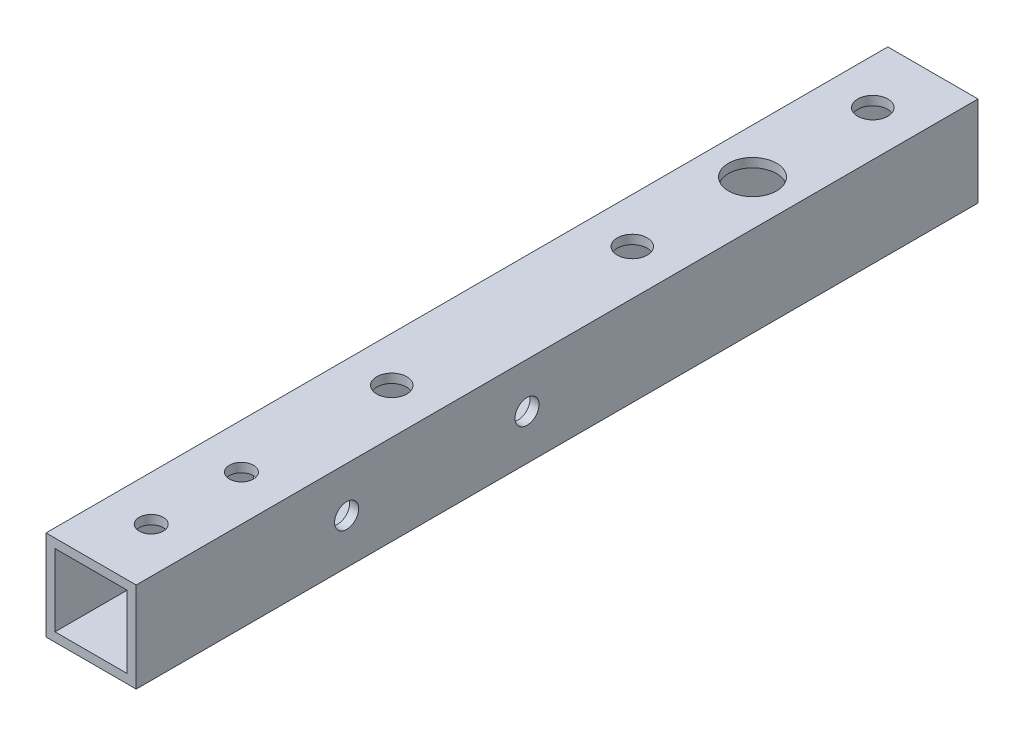
ISO-10303-21;
HEADER;
FILE_DESCRIPTION(('STEP AP214'),'2;1');
FILE_NAME('part.step','',(''),(''),'','','');
FILE_SCHEMA(('AUTOMOTIVE_DESIGN { 1 0 10303 214 1 1 1 1 }'));
ENDSEC;
DATA;
#1=APPLICATION_CONTEXT('core data for automotive mechanical design processes');
#2=APPLICATION_PROTOCOL_DEFINITION('international standard','automotive_design',2000,#1);
#3=PRODUCT_CONTEXT('',#1,'mechanical');
#4=PRODUCT('Part','Part','',(#3));
#5=PRODUCT_RELATED_PRODUCT_CATEGORY('part','',(#4));
#6=PRODUCT_DEFINITION_FORMATION('','',#4);
#7=PRODUCT_DEFINITION_CONTEXT('part definition',#1,'design');
#8=PRODUCT_DEFINITION('design','',#6,#7);
#9=PRODUCT_DEFINITION_SHAPE('','',#8);
#10=(LENGTH_UNIT() NAMED_UNIT(*) SI_UNIT(.MILLI.,.METRE.));
#11=(NAMED_UNIT(*) PLANE_ANGLE_UNIT() SI_UNIT($,.RADIAN.));
#12=(NAMED_UNIT(*) SI_UNIT($,.STERADIAN.) SOLID_ANGLE_UNIT());
#13=UNCERTAINTY_MEASURE_WITH_UNIT(LENGTH_MEASURE(1.E-05),#10,'distance_accuracy_value','');
#14=(GEOMETRIC_REPRESENTATION_CONTEXT(3) GLOBAL_UNCERTAINTY_ASSIGNED_CONTEXT((#13)) GLOBAL_UNIT_ASSIGNED_CONTEXT((#10,
#11,#12)) REPRESENTATION_CONTEXT('',''));
#15=CARTESIAN_POINT('',(0.,0.,0.));
#16=DIRECTION('',(0.,0.,1.));
#17=DIRECTION('',(1.,0.,0.));
#18=AXIS2_PLACEMENT_3D('',#15,#16,#17);
#19=CARTESIAN_POINT('',(0.,0.,140.));
#20=DIRECTION('',(0.,0.,-1.));
#21=DIRECTION('',(-1.,0.,0.));
#22=AXIS2_PLACEMENT_3D('',#19,#20,#21);
#23=PLANE('',#22);
#24=DIRECTION('',(0.,1.,0.));
#25=VECTOR('',#24,1.);
#26=CARTESIAN_POINT('',(7.5,-7.5,140.));
#27=LINE('',#26,#25);
#28=CARTESIAN_POINT('',(7.5,-7.5,140.));
#29=VERTEX_POINT('',#28);
#30=CARTESIAN_POINT('',(7.5,7.5,140.));
#31=VERTEX_POINT('',#30);
#32=EDGE_CURVE('E138',#29,#31,#27,.T.);
#33=ORIENTED_EDGE('',*,*,#32,.T.);
#34=DIRECTION('',(-1.,0.,0.));
#35=VECTOR('',#34,1.);
#36=CARTESIAN_POINT('',(-7.5,7.5,140.));
#37=LINE('',#36,#35);
#38=CARTESIAN_POINT('',(-7.5,7.5,140.));
#39=VERTEX_POINT('',#38);
#40=EDGE_CURVE('E141',#31,#39,#37,.T.);
#41=ORIENTED_EDGE('',*,*,#40,.T.);
#42=DIRECTION('',(0.,-1.,0.));
#43=VECTOR('',#42,1.);
#44=CARTESIAN_POINT('',(-7.5,-7.5,140.));
#45=LINE('',#44,#43);
#46=CARTESIAN_POINT('',(-7.5,-7.5,140.));
#47=VERTEX_POINT('',#46);
#48=EDGE_CURVE('E144',#39,#47,#45,.T.);
#49=ORIENTED_EDGE('',*,*,#48,.T.);
#50=DIRECTION('',(1.,0.,0.));
#51=VECTOR('',#50,1.);
#52=CARTESIAN_POINT('',(-7.5,-7.5,140.));
#53=LINE('',#52,#51);
#54=EDGE_CURVE('E146',#47,#29,#53,.T.);
#55=ORIENTED_EDGE('',*,*,#54,.T.);
#56=EDGE_LOOP('',(#33,#41,#49,#55));
#57=FACE_BOUND('',#56,.T.);
#58=DIRECTION('',(0.,1.,0.));
#59=VECTOR('',#58,1.);
#60=CARTESIAN_POINT('',(6.,6.,140.));
#61=LINE('',#60,#59);
#62=CARTESIAN_POINT('',(6.,-6.,140.));
#63=VERTEX_POINT('',#62);
#64=CARTESIAN_POINT('',(6.,6.,140.));
#65=VERTEX_POINT('',#64);
#66=EDGE_CURVE('E100',#63,#65,#61,.T.);
#67=ORIENTED_EDGE('',*,*,#66,.F.);
#68=DIRECTION('',(1.,0.,0.));
#69=VECTOR('',#68,1.);
#70=CARTESIAN_POINT('',(-6.,-6.,140.));
#71=LINE('',#70,#69);
#72=CARTESIAN_POINT('',(-6.,-6.,140.));
#73=VERTEX_POINT('',#72);
#74=EDGE_CURVE('E122',#73,#63,#71,.T.);
#75=ORIENTED_EDGE('',*,*,#74,.F.);
#76=DIRECTION('',(0.,-1.,0.));
#77=VECTOR('',#76,1.);
#78=CARTESIAN_POINT('',(-6.,6.,140.));
#79=LINE('',#78,#77);
#80=CARTESIAN_POINT('',(-6.,6.,140.));
#81=VERTEX_POINT('',#80);
#82=EDGE_CURVE('E120',#81,#73,#79,.T.);
#83=ORIENTED_EDGE('',*,*,#82,.F.);
#84=DIRECTION('',(-1.,0.,0.));
#85=VECTOR('',#84,1.);
#86=CARTESIAN_POINT('',(-6.,6.,140.));
#87=LINE('',#86,#85);
#88=EDGE_CURVE('E108',#65,#81,#87,.T.);
#89=ORIENTED_EDGE('',*,*,#88,.F.);
#90=EDGE_LOOP('',(#67,#75,#83,#89));
#91=FACE_BOUND('',#90,.T.);
#92=ADVANCED_FACE('F33',(#57,#91),#23,.F.);
#93=CARTESIAN_POINT('',(0.,0.,0.));
#94=DIRECTION('',(0.,0.,-1.));
#95=DIRECTION('',(-1.,0.,0.));
#96=AXIS2_PLACEMENT_3D('',#93,#94,#95);
#97=PLANE('',#96);
#98=DIRECTION('',(0.,1.,0.));
#99=VECTOR('',#98,1.);
#100=CARTESIAN_POINT('',(7.5,-7.5,0.));
#101=LINE('',#100,#99);
#102=CARTESIAN_POINT('',(7.5,-7.5,0.));
#103=VERTEX_POINT('',#102);
#104=CARTESIAN_POINT('',(7.5,7.5,0.));
#105=VERTEX_POINT('',#104);
#106=EDGE_CURVE('E116',#103,#105,#101,.T.);
#107=ORIENTED_EDGE('',*,*,#106,.F.);
#108=DIRECTION('',(1.,0.,0.));
#109=VECTOR('',#108,1.);
#110=CARTESIAN_POINT('',(-7.5,-7.5,0.));
#111=LINE('',#110,#109);
#112=CARTESIAN_POINT('',(-7.5,-7.5,0.));
#113=VERTEX_POINT('',#112);
#114=EDGE_CURVE('E142',#113,#103,#111,.T.);
#115=ORIENTED_EDGE('',*,*,#114,.F.);
#116=DIRECTION('',(0.,-1.,0.));
#117=VECTOR('',#116,1.);
#118=CARTESIAN_POINT('',(-7.5,-7.5,0.));
#119=LINE('',#118,#117);
#120=CARTESIAN_POINT('',(-7.5,7.5,0.));
#121=VERTEX_POINT('',#120);
#122=EDGE_CURVE('E153',#121,#113,#119,.T.);
#123=ORIENTED_EDGE('',*,*,#122,.F.);
#124=DIRECTION('',(-1.,0.,0.));
#125=VECTOR('',#124,1.);
#126=CARTESIAN_POINT('',(-7.5,7.5,0.));
#127=LINE('',#126,#125);
#128=EDGE_CURVE('E151',#105,#121,#127,.T.);
#129=ORIENTED_EDGE('',*,*,#128,.F.);
#130=EDGE_LOOP('',(#107,#115,#123,#129));
#131=FACE_BOUND('',#130,.T.);
#132=DIRECTION('',(1.,0.,0.));
#133=VECTOR('',#132,1.);
#134=CARTESIAN_POINT('',(-6.,-6.,0.));
#135=LINE('',#134,#133);
#136=CARTESIAN_POINT('',(-6.,-6.,0.));
#137=VERTEX_POINT('',#136);
#138=CARTESIAN_POINT('',(6.,-6.,0.));
#139=VERTEX_POINT('',#138);
#140=EDGE_CURVE('E109',#137,#139,#135,.T.);
#141=ORIENTED_EDGE('',*,*,#140,.T.);
#142=DIRECTION('',(0.,1.,0.));
#143=VECTOR('',#142,1.);
#144=CARTESIAN_POINT('',(6.,6.,0.));
#145=LINE('',#144,#143);
#146=CARTESIAN_POINT('',(6.,6.,0.));
#147=VERTEX_POINT('',#146);
#148=EDGE_CURVE('E58',#139,#147,#145,.T.);
#149=ORIENTED_EDGE('',*,*,#148,.T.);
#150=DIRECTION('',(-1.,0.,0.));
#151=VECTOR('',#150,1.);
#152=CARTESIAN_POINT('',(-6.,6.,0.));
#153=LINE('',#152,#151);
#154=CARTESIAN_POINT('',(-6.,6.,0.));
#155=VERTEX_POINT('',#154);
#156=EDGE_CURVE('E115',#147,#155,#153,.T.);
#157=ORIENTED_EDGE('',*,*,#156,.T.);
#158=DIRECTION('',(0.,-1.,0.));
#159=VECTOR('',#158,1.);
#160=CARTESIAN_POINT('',(-6.,6.,0.));
#161=LINE('',#160,#159);
#162=EDGE_CURVE('E130',#155,#137,#161,.T.);
#163=ORIENTED_EDGE('',*,*,#162,.T.);
#164=EDGE_LOOP('',(#141,#149,#157,#163));
#165=FACE_BOUND('',#164,.T.);
#166=ADVANCED_FACE('F261',(#131,#165),#97,.T.);
#167=CARTESIAN_POINT('',(7.5,-7.5,140.));
#168=DIRECTION('',(-1.,0.,0.));
#169=DIRECTION('',(0.,0.,1.));
#170=AXIS2_PLACEMENT_3D('',#167,#168,#169);
#171=PLANE('',#170);
#172=CARTESIAN_POINT('',(7.5,0.,75.));
#173=DIRECTION('',(1.,0.,0.));
#174=DIRECTION('',(0.,0.,-1.));
#175=AXIS2_PLACEMENT_3D('',#172,#173,#174);
#176=CIRCLE('',#175,2.);
#177=CARTESIAN_POINT('',(7.5,0.,73.));
#178=VERTEX_POINT('',#177);
#179=EDGE_CURVE('E187',#178,#178,#176,.T.);
#180=ORIENTED_EDGE('',*,*,#179,.F.);
#181=EDGE_LOOP('',(#180));
#182=FACE_BOUND('',#181,.T.);
#183=CARTESIAN_POINT('',(7.5,0.,105.));
#184=DIRECTION('',(1.,0.,0.));
#185=DIRECTION('',(0.,0.,-1.));
#186=AXIS2_PLACEMENT_3D('',#183,#184,#185);
#187=CIRCLE('',#186,2.);
#188=CARTESIAN_POINT('',(7.5,0.,103.));
#189=VERTEX_POINT('',#188);
#190=EDGE_CURVE('E182',#189,#189,#187,.T.);
#191=ORIENTED_EDGE('',*,*,#190,.F.);
#192=EDGE_LOOP('',(#191));
#193=FACE_BOUND('',#192,.T.);
#194=ORIENTED_EDGE('',*,*,#106,.T.);
#195=DIRECTION('',(0.,0.,-1.));
#196=VECTOR('',#195,1.);
#197=CARTESIAN_POINT('',(7.5,7.5,140.));
#198=LINE('',#197,#196);
#199=EDGE_CURVE('E11',#31,#105,#198,.T.);
#200=ORIENTED_EDGE('',*,*,#199,.F.);
#201=ORIENTED_EDGE('',*,*,#32,.F.);
#202=DIRECTION('',(0.,0.,-1.));
#203=VECTOR('',#202,1.);
#204=CARTESIAN_POINT('',(7.5,-7.5,140.));
#205=LINE('',#204,#203);
#206=EDGE_CURVE('E148',#29,#103,#205,.T.);
#207=ORIENTED_EDGE('',*,*,#206,.T.);
#208=EDGE_LOOP('',(#194,#200,#201,#207));
#209=FACE_BOUND('',#208,.T.);
#210=ADVANCED_FACE('F35',(#182,#193,#209),#171,.F.);
#211=CARTESIAN_POINT('',(-7.5,7.5,140.));
#212=DIRECTION('',(0.,-1.,0.));
#213=DIRECTION('',(0.,0.,-1.));
#214=AXIS2_PLACEMENT_3D('',#211,#212,#213);
#215=PLANE('',#214);
#216=CARTESIAN_POINT('',(0.,7.5,90.));
#217=DIRECTION('',(0.,1.,0.));
#218=DIRECTION('',(0.,0.,1.));
#219=AXIS2_PLACEMENT_3D('',#216,#217,#218);
#220=CIRCLE('',#219,2.5);
#221=CARTESIAN_POINT('',(0.,7.5,92.5));
#222=VERTEX_POINT('',#221);
#223=EDGE_CURVE('E288',#222,#222,#220,.T.);
#224=ORIENTED_EDGE('',*,*,#223,.F.);
#225=EDGE_LOOP('',(#224));
#226=FACE_BOUND('',#225,.T.);
#227=CARTESIAN_POINT('',(0.,7.5,50.));
#228=DIRECTION('',(0.,-1.,0.));
#229=DIRECTION('',(0.,0.,-1.));
#230=AXIS2_PLACEMENT_3D('',#227,#228,#229);
#231=CIRCLE('',#230,2.5);
#232=CARTESIAN_POINT('',(0.,7.5,47.5));
#233=VERTEX_POINT('',#232);
#234=EDGE_CURVE('E191',#233,#233,#231,.T.);
#235=ORIENTED_EDGE('',*,*,#234,.T.);
#236=EDGE_LOOP('',(#235));
#237=FACE_BOUND('',#236,.T.);
#238=CARTESIAN_POINT('',(0.,7.5,9.99999999999999));
#239=DIRECTION('',(0.,-1.,0.));
#240=DIRECTION('',(0.,0.,1.));
#241=AXIS2_PLACEMENT_3D('',#238,#239,#240);
#242=CIRCLE('',#241,2.5);
#243=CARTESIAN_POINT('',(0.,7.5,12.5));
#244=VERTEX_POINT('',#243);
#245=EDGE_CURVE('E295',#244,#244,#242,.T.);
#246=ORIENTED_EDGE('',*,*,#245,.T.);
#247=EDGE_LOOP('',(#246));
#248=FACE_BOUND('',#247,.T.);
#249=CARTESIAN_POINT('',(0.,7.5,115.));
#250=DIRECTION('',(0.,-1.,0.));
#251=DIRECTION('',(0.,0.,-1.));
#252=AXIS2_PLACEMENT_3D('',#249,#250,#251);
#253=CIRCLE('',#252,2.);
#254=CARTESIAN_POINT('',(0.,7.5,113.));
#255=VERTEX_POINT('',#254);
#256=EDGE_CURVE('E225',#255,#255,#253,.T.);
#257=ORIENTED_EDGE('',*,*,#256,.T.);
#258=EDGE_LOOP('',(#257));
#259=FACE_BOUND('',#258,.T.);
#260=CARTESIAN_POINT('',(0.,7.5,130.));
#261=DIRECTION('',(0.,-1.,0.));
#262=DIRECTION('',(0.,0.,-1.));
#263=AXIS2_PLACEMENT_3D('',#260,#261,#262);
#264=CIRCLE('',#263,2.);
#265=CARTESIAN_POINT('',(0.,7.5,128.));
#266=VERTEX_POINT('',#265);
#267=EDGE_CURVE('E232',#266,#266,#264,.T.);
#268=ORIENTED_EDGE('',*,*,#267,.T.);
#269=EDGE_LOOP('',(#268));
#270=FACE_BOUND('',#269,.T.);
#271=CARTESIAN_POINT('',(0.,7.5,30.));
#272=DIRECTION('',(0.,1.,0.));
#273=DIRECTION('',(0.,0.,1.));
#274=AXIS2_PLACEMENT_3D('',#271,#272,#273);
#275=CIRCLE('',#274,4.);
#276=CARTESIAN_POINT('',(0.,7.5,34.));
#277=VERTEX_POINT('',#276);
#278=EDGE_CURVE('E167',#277,#277,#275,.T.);
#279=ORIENTED_EDGE('',*,*,#278,.F.);
#280=EDGE_LOOP('',(#279));
#281=FACE_BOUND('',#280,.T.);
#282=ORIENTED_EDGE('',*,*,#128,.T.);
#283=DIRECTION('',(0.,0.,-1.));
#284=VECTOR('',#283,1.);
#285=CARTESIAN_POINT('',(-7.5,7.5,140.));
#286=LINE('',#285,#284);
#287=EDGE_CURVE('E42',#39,#121,#286,.T.);
#288=ORIENTED_EDGE('',*,*,#287,.F.);
#289=ORIENTED_EDGE('',*,*,#40,.F.);
#290=ORIENTED_EDGE('',*,*,#199,.T.);
#291=EDGE_LOOP('',(#282,#288,#289,#290));
#292=FACE_BOUND('',#291,.T.);
#293=ADVANCED_FACE('F277',(#226,#237,#248,#259,#270,#281,#292),#215,.F.);
#294=CARTESIAN_POINT('',(-7.5,-7.5,140.));
#295=DIRECTION('',(1.,0.,0.));
#296=DIRECTION('',(0.,0.,-1.));
#297=AXIS2_PLACEMENT_3D('',#294,#295,#296);
#298=PLANE('',#297);
#299=CARTESIAN_POINT('',(-7.5,0.,75.));
#300=DIRECTION('',(1.,0.,0.));
#301=DIRECTION('',(0.,0.,-1.));
#302=AXIS2_PLACEMENT_3D('',#299,#300,#301);
#303=CIRCLE('',#302,2.);
#304=CARTESIAN_POINT('',(-7.5,0.,73.));
#305=VERTEX_POINT('',#304);
#306=EDGE_CURVE('E211',#305,#305,#303,.T.);
#307=ORIENTED_EDGE('',*,*,#306,.T.);
#308=EDGE_LOOP('',(#307));
#309=FACE_BOUND('',#308,.T.);
#310=CARTESIAN_POINT('',(-7.5,0.,105.));
#311=DIRECTION('',(1.,0.,0.));
#312=DIRECTION('',(0.,0.,-1.));
#313=AXIS2_PLACEMENT_3D('',#310,#311,#312);
#314=CIRCLE('',#313,2.);
#315=CARTESIAN_POINT('',(-7.5,0.,103.));
#316=VERTEX_POINT('',#315);
#317=EDGE_CURVE('E218',#316,#316,#314,.T.);
#318=ORIENTED_EDGE('',*,*,#317,.T.);
#319=EDGE_LOOP('',(#318));
#320=FACE_BOUND('',#319,.T.);
#321=ORIENTED_EDGE('',*,*,#122,.T.);
#322=DIRECTION('',(0.,0.,-1.));
#323=VECTOR('',#322,1.);
#324=CARTESIAN_POINT('',(-7.5,-7.5,140.));
#325=LINE('',#324,#323);
#326=EDGE_CURVE('E158',#47,#113,#325,.T.);
#327=ORIENTED_EDGE('',*,*,#326,.F.);
#328=ORIENTED_EDGE('',*,*,#48,.F.);
#329=ORIENTED_EDGE('',*,*,#287,.T.);
#330=EDGE_LOOP('',(#321,#327,#328,#329));
#331=FACE_BOUND('',#330,.T.);
#332=ADVANCED_FACE('F274',(#309,#320,#331),#298,.F.);
#333=CARTESIAN_POINT('',(-7.5,-7.5,140.));
#334=DIRECTION('',(0.,1.,0.));
#335=DIRECTION('',(0.,0.,1.));
#336=AXIS2_PLACEMENT_3D('',#333,#334,#335);
#337=PLANE('',#336);
#338=CARTESIAN_POINT('',(0.,-7.5,90.));
#339=DIRECTION('',(0.,1.,0.));
#340=DIRECTION('',(0.,0.,1.));
#341=AXIS2_PLACEMENT_3D('',#338,#339,#340);
#342=CIRCLE('',#341,2.5);
#343=CARTESIAN_POINT('',(0.,-7.5,92.5));
#344=VERTEX_POINT('',#343);
#345=EDGE_CURVE('E516',#344,#344,#342,.T.);
#346=ORIENTED_EDGE('',*,*,#345,.T.);
#347=EDGE_LOOP('',(#346));
#348=FACE_BOUND('',#347,.T.);
#349=CARTESIAN_POINT('',(0.,-7.5,50.));
#350=DIRECTION('',(0.,-1.,0.));
#351=DIRECTION('',(0.,0.,-1.));
#352=AXIS2_PLACEMENT_3D('',#349,#350,#351);
#353=CIRCLE('',#352,2.5);
#354=CARTESIAN_POINT('',(0.,-7.5,47.5));
#355=VERTEX_POINT('',#354);
#356=EDGE_CURVE('E523',#355,#355,#353,.T.);
#357=ORIENTED_EDGE('',*,*,#356,.F.);
#358=EDGE_LOOP('',(#357));
#359=FACE_BOUND('',#358,.T.);
#360=CARTESIAN_POINT('',(0.,-7.5,9.99999999999999));
#361=DIRECTION('',(0.,-1.,0.));
#362=DIRECTION('',(0.,0.,1.));
#363=AXIS2_PLACEMENT_3D('',#360,#361,#362);
#364=CIRCLE('',#363,2.5);
#365=CARTESIAN_POINT('',(0.,-7.5,12.5));
#366=VERTEX_POINT('',#365);
#367=EDGE_CURVE('E204',#366,#366,#364,.T.);
#368=ORIENTED_EDGE('',*,*,#367,.F.);
#369=EDGE_LOOP('',(#368));
#370=FACE_BOUND('',#369,.T.);
#371=CARTESIAN_POINT('',(0.,-7.5,115.));
#372=DIRECTION('',(0.,-1.,0.));
#373=DIRECTION('',(0.,0.,-1.));
#374=AXIS2_PLACEMENT_3D('',#371,#372,#373);
#375=CIRCLE('',#374,2.);
#376=CARTESIAN_POINT('',(0.,-7.5,113.));
#377=VERTEX_POINT('',#376);
#378=EDGE_CURVE('E177',#377,#377,#375,.T.);
#379=ORIENTED_EDGE('',*,*,#378,.F.);
#380=EDGE_LOOP('',(#379));
#381=FACE_BOUND('',#380,.T.);
#382=CARTESIAN_POINT('',(0.,-7.5,130.));
#383=DIRECTION('',(0.,-1.,0.));
#384=DIRECTION('',(0.,0.,-1.));
#385=AXIS2_PLACEMENT_3D('',#382,#383,#384);
#386=CIRCLE('',#385,2.);
#387=CARTESIAN_POINT('',(0.,-7.5,128.));
#388=VERTEX_POINT('',#387);
#389=EDGE_CURVE('E172',#388,#388,#386,.T.);
#390=ORIENTED_EDGE('',*,*,#389,.F.);
#391=EDGE_LOOP('',(#390));
#392=FACE_BOUND('',#391,.T.);
#393=CARTESIAN_POINT('',(0.,-7.5,30.));
#394=DIRECTION('',(0.,1.,0.));
#395=DIRECTION('',(0.,0.,1.));
#396=AXIS2_PLACEMENT_3D('',#393,#394,#395);
#397=CIRCLE('',#396,4.);
#398=CARTESIAN_POINT('',(0.,-7.5,34.));
#399=VERTEX_POINT('',#398);
#400=EDGE_CURVE('E128',#399,#399,#397,.T.);
#401=ORIENTED_EDGE('',*,*,#400,.T.);
#402=EDGE_LOOP('',(#401));
#403=FACE_BOUND('',#402,.T.);
#404=ORIENTED_EDGE('',*,*,#114,.T.);
#405=ORIENTED_EDGE('',*,*,#206,.F.);
#406=ORIENTED_EDGE('',*,*,#54,.F.);
#407=ORIENTED_EDGE('',*,*,#326,.T.);
#408=EDGE_LOOP('',(#404,#405,#406,#407));
#409=FACE_BOUND('',#408,.T.);
#410=ADVANCED_FACE('F241',(#348,#359,#370,#381,#392,#403,#409),#337,.F.);
#411=CARTESIAN_POINT('',(6.,6.,140.));
#412=DIRECTION('',(-1.,0.,0.));
#413=DIRECTION('',(0.,-1.,0.));
#414=AXIS2_PLACEMENT_3D('',#411,#412,#413);
#415=PLANE('',#414);
#416=CARTESIAN_POINT('',(6.,0.,75.));
#417=DIRECTION('',(-1.,0.,0.));
#418=DIRECTION('',(0.,-1.,0.));
#419=AXIS2_PLACEMENT_3D('',#416,#417,#418);
#420=CIRCLE('',#419,2.);
#421=CARTESIAN_POINT('',(6.,-2.00000000000001,75.));
#422=VERTEX_POINT('',#421);
#423=EDGE_CURVE('E186',#422,#422,#420,.T.);
#424=ORIENTED_EDGE('',*,*,#423,.F.);
#425=EDGE_LOOP('',(#424));
#426=FACE_BOUND('',#425,.T.);
#427=CARTESIAN_POINT('',(6.,0.,105.));
#428=DIRECTION('',(-1.,0.,0.));
#429=DIRECTION('',(0.,-1.,0.));
#430=AXIS2_PLACEMENT_3D('',#427,#428,#429);
#431=CIRCLE('',#430,2.);
#432=CARTESIAN_POINT('',(6.,-2.00000000000001,105.));
#433=VERTEX_POINT('',#432);
#434=EDGE_CURVE('E181',#433,#433,#431,.T.);
#435=ORIENTED_EDGE('',*,*,#434,.F.);
#436=EDGE_LOOP('',(#435));
#437=FACE_BOUND('',#436,.T.);
#438=ORIENTED_EDGE('',*,*,#148,.F.);
#439=DIRECTION('',(0.,0.,-1.));
#440=VECTOR('',#439,1.);
#441=CARTESIAN_POINT('',(6.,-6.,140.));
#442=LINE('',#441,#440);
#443=EDGE_CURVE('E104',#63,#139,#442,.T.);
#444=ORIENTED_EDGE('',*,*,#443,.F.);
#445=ORIENTED_EDGE('',*,*,#66,.T.);
#446=DIRECTION('',(0.,0.,-1.));
#447=VECTOR('',#446,1.);
#448=CARTESIAN_POINT('',(6.,6.,140.));
#449=LINE('',#448,#447);
#450=EDGE_CURVE('E103',#65,#147,#449,.T.);
#451=ORIENTED_EDGE('',*,*,#450,.T.);
#452=EDGE_LOOP('',(#438,#444,#445,#451));
#453=FACE_BOUND('',#452,.T.);
#454=ADVANCED_FACE('F102',(#426,#437,#453),#415,.T.);
#455=CARTESIAN_POINT('',(-6.,6.,140.));
#456=DIRECTION('',(0.,-1.,0.));
#457=DIRECTION('',(0.,0.,-1.));
#458=AXIS2_PLACEMENT_3D('',#455,#456,#457);
#459=PLANE('',#458);
#460=CARTESIAN_POINT('',(0.,6.,90.));
#461=DIRECTION('',(0.,-1.,0.));
#462=DIRECTION('',(0.,0.,-1.));
#463=AXIS2_PLACEMENT_3D('',#460,#461,#462);
#464=CIRCLE('',#463,2.5);
#465=CARTESIAN_POINT('',(0.,6.,87.5));
#466=VERTEX_POINT('',#465);
#467=EDGE_CURVE('E515',#466,#466,#464,.T.);
#468=ORIENTED_EDGE('',*,*,#467,.F.);
#469=EDGE_LOOP('',(#468));
#470=FACE_BOUND('',#469,.T.);
#471=CARTESIAN_POINT('',(0.,6.,50.));
#472=DIRECTION('',(0.,-1.,0.));
#473=DIRECTION('',(0.,0.,-1.));
#474=AXIS2_PLACEMENT_3D('',#471,#472,#473);
#475=CIRCLE('',#474,2.5);
#476=CARTESIAN_POINT('',(0.,6.,47.5));
#477=VERTEX_POINT('',#476);
#478=EDGE_CURVE('E194',#477,#477,#475,.T.);
#479=ORIENTED_EDGE('',*,*,#478,.F.);
#480=EDGE_LOOP('',(#479));
#481=FACE_BOUND('',#480,.T.);
#482=CARTESIAN_POINT('',(0.,6.,9.99999999999999));
#483=DIRECTION('',(0.,-1.,0.));
#484=DIRECTION('',(0.,0.,-1.));
#485=AXIS2_PLACEMENT_3D('',#482,#483,#484);
#486=CIRCLE('',#485,2.5);
#487=CARTESIAN_POINT('',(0.,6.,7.49999999999999));
#488=VERTEX_POINT('',#487);
#489=EDGE_CURVE('E190',#488,#488,#486,.T.);
#490=ORIENTED_EDGE('',*,*,#489,.F.);
#491=EDGE_LOOP('',(#490));
#492=FACE_BOUND('',#491,.T.);
#493=CARTESIAN_POINT('',(0.,6.,115.));
#494=DIRECTION('',(0.,-1.,0.));
#495=DIRECTION('',(0.,0.,-1.));
#496=AXIS2_PLACEMENT_3D('',#493,#494,#495);
#497=CIRCLE('',#496,2.);
#498=CARTESIAN_POINT('',(0.,6.,113.));
#499=VERTEX_POINT('',#498);
#500=EDGE_CURVE('E176',#499,#499,#497,.T.);
#501=ORIENTED_EDGE('',*,*,#500,.F.);
#502=EDGE_LOOP('',(#501));
#503=FACE_BOUND('',#502,.T.);
#504=CARTESIAN_POINT('',(0.,6.,130.));
#505=DIRECTION('',(0.,-1.,0.));
#506=DIRECTION('',(0.,0.,-1.));
#507=AXIS2_PLACEMENT_3D('',#504,#505,#506);
#508=CIRCLE('',#507,2.);
#509=CARTESIAN_POINT('',(0.,6.,128.));
#510=VERTEX_POINT('',#509);
#511=EDGE_CURVE('E171',#510,#510,#508,.T.);
#512=ORIENTED_EDGE('',*,*,#511,.F.);
#513=EDGE_LOOP('',(#512));
#514=FACE_BOUND('',#513,.T.);
#515=CARTESIAN_POINT('',(0.,6.,30.));
#516=DIRECTION('',(0.,-1.,0.));
#517=DIRECTION('',(0.,0.,-1.));
#518=AXIS2_PLACEMENT_3D('',#515,#516,#517);
#519=CIRCLE('',#518,4.);
#520=CARTESIAN_POINT('',(0.,6.,26.));
#521=VERTEX_POINT('',#520);
#522=EDGE_CURVE('E166',#521,#521,#519,.T.);
#523=ORIENTED_EDGE('',*,*,#522,.F.);
#524=EDGE_LOOP('',(#523));
#525=FACE_BOUND('',#524,.T.);
#526=ORIENTED_EDGE('',*,*,#156,.F.);
#527=ORIENTED_EDGE('',*,*,#450,.F.);
#528=ORIENTED_EDGE('',*,*,#88,.T.);
#529=DIRECTION('',(0.,0.,-1.));
#530=VECTOR('',#529,1.);
#531=CARTESIAN_POINT('',(-6.,6.,140.));
#532=LINE('',#531,#530);
#533=EDGE_CURVE('E117',#81,#155,#532,.T.);
#534=ORIENTED_EDGE('',*,*,#533,.T.);
#535=EDGE_LOOP('',(#526,#527,#528,#534));
#536=FACE_BOUND('',#535,.T.);
#537=ADVANCED_FACE('F112',(#470,#481,#492,#503,#514,#525,#536),#459,.T.);
#538=CARTESIAN_POINT('',(-6.,6.,140.));
#539=DIRECTION('',(1.,0.,0.));
#540=DIRECTION('',(0.,1.,0.));
#541=AXIS2_PLACEMENT_3D('',#538,#539,#540);
#542=PLANE('',#541);
#543=CARTESIAN_POINT('',(-6.,0.,75.));
#544=DIRECTION('',(1.,0.,0.));
#545=DIRECTION('',(0.,1.,0.));
#546=AXIS2_PLACEMENT_3D('',#543,#544,#545);
#547=CIRCLE('',#546,2.);
#548=CARTESIAN_POINT('',(-6.,1.99999999999999,75.));
#549=VERTEX_POINT('',#548);
#550=EDGE_CURVE('E183',#549,#549,#547,.T.);
#551=ORIENTED_EDGE('',*,*,#550,.F.);
#552=EDGE_LOOP('',(#551));
#553=FACE_BOUND('',#552,.T.);
#554=CARTESIAN_POINT('',(-6.,0.,105.));
#555=DIRECTION('',(1.,0.,0.));
#556=DIRECTION('',(0.,1.,0.));
#557=AXIS2_PLACEMENT_3D('',#554,#555,#556);
#558=CIRCLE('',#557,2.);
#559=CARTESIAN_POINT('',(-6.,1.99999999999998,105.));
#560=VERTEX_POINT('',#559);
#561=EDGE_CURVE('E178',#560,#560,#558,.T.);
#562=ORIENTED_EDGE('',*,*,#561,.F.);
#563=EDGE_LOOP('',(#562));
#564=FACE_BOUND('',#563,.T.);
#565=ORIENTED_EDGE('',*,*,#162,.F.);
#566=ORIENTED_EDGE('',*,*,#533,.F.);
#567=ORIENTED_EDGE('',*,*,#82,.T.);
#568=DIRECTION('',(0.,0.,-1.));
#569=VECTOR('',#568,1.);
#570=CARTESIAN_POINT('',(-6.,-6.,140.));
#571=LINE('',#570,#569);
#572=EDGE_CURVE('E50',#73,#137,#571,.T.);
#573=ORIENTED_EDGE('',*,*,#572,.T.);
#574=EDGE_LOOP('',(#565,#566,#567,#573));
#575=FACE_BOUND('',#574,.T.);
#576=ADVANCED_FACE('F256',(#553,#564,#575),#542,.T.);
#577=CARTESIAN_POINT('',(-6.,-6.,140.));
#578=DIRECTION('',(0.,1.,0.));
#579=DIRECTION('',(0.,0.,1.));
#580=AXIS2_PLACEMENT_3D('',#577,#578,#579);
#581=PLANE('',#580);
#582=CARTESIAN_POINT('',(0.,-6.,90.));
#583=DIRECTION('',(0.,1.,0.));
#584=DIRECTION('',(0.,0.,1.));
#585=AXIS2_PLACEMENT_3D('',#582,#583,#584);
#586=CIRCLE('',#585,2.5);
#587=CARTESIAN_POINT('',(0.,-6.,92.5));
#588=VERTEX_POINT('',#587);
#589=EDGE_CURVE('E37',#588,#588,#586,.T.);
#590=ORIENTED_EDGE('',*,*,#589,.F.);
#591=EDGE_LOOP('',(#590));
#592=FACE_BOUND('',#591,.T.);
#593=CARTESIAN_POINT('',(0.,-6.,50.));
#594=DIRECTION('',(0.,1.,0.));
#595=DIRECTION('',(0.,0.,1.));
#596=AXIS2_PLACEMENT_3D('',#593,#594,#595);
#597=CIRCLE('',#596,2.5);
#598=CARTESIAN_POINT('',(0.,-6.,52.5));
#599=VERTEX_POINT('',#598);
#600=EDGE_CURVE('E192',#599,#599,#597,.T.);
#601=ORIENTED_EDGE('',*,*,#600,.F.);
#602=EDGE_LOOP('',(#601));
#603=FACE_BOUND('',#602,.T.);
#604=CARTESIAN_POINT('',(0.,-6.,9.99999999999999));
#605=DIRECTION('',(0.,1.,0.));
#606=DIRECTION('',(0.,0.,1.));
#607=AXIS2_PLACEMENT_3D('',#604,#605,#606);
#608=CIRCLE('',#607,2.5);
#609=CARTESIAN_POINT('',(0.,-6.,12.5));
#610=VERTEX_POINT('',#609);
#611=EDGE_CURVE('E188',#610,#610,#608,.T.);
#612=ORIENTED_EDGE('',*,*,#611,.F.);
#613=EDGE_LOOP('',(#612));
#614=FACE_BOUND('',#613,.T.);
#615=CARTESIAN_POINT('',(0.,-6.00000000000001,115.));
#616=DIRECTION('',(0.,1.,0.));
#617=DIRECTION('',(0.,0.,1.));
#618=AXIS2_PLACEMENT_3D('',#615,#616,#617);
#619=CIRCLE('',#618,2.);
#620=CARTESIAN_POINT('',(0.,-6.00000000000001,117.));
#621=VERTEX_POINT('',#620);
#622=EDGE_CURVE('E173',#621,#621,#619,.T.);
#623=ORIENTED_EDGE('',*,*,#622,.F.);
#624=EDGE_LOOP('',(#623));
#625=FACE_BOUND('',#624,.T.);
#626=CARTESIAN_POINT('',(0.,-6.00000000000001,130.));
#627=DIRECTION('',(0.,1.,0.));
#628=DIRECTION('',(0.,0.,1.));
#629=AXIS2_PLACEMENT_3D('',#626,#627,#628);
#630=CIRCLE('',#629,2.);
#631=CARTESIAN_POINT('',(0.,-6.00000000000001,132.));
#632=VERTEX_POINT('',#631);
#633=EDGE_CURVE('E168',#632,#632,#630,.T.);
#634=ORIENTED_EDGE('',*,*,#633,.F.);
#635=EDGE_LOOP('',(#634));
#636=FACE_BOUND('',#635,.T.);
#637=CARTESIAN_POINT('',(0.,-6.,30.));
#638=DIRECTION('',(0.,1.,0.));
#639=DIRECTION('',(0.,0.,1.));
#640=AXIS2_PLACEMENT_3D('',#637,#638,#639);
#641=CIRCLE('',#640,4.);
#642=CARTESIAN_POINT('',(0.,-6.,34.));
#643=VERTEX_POINT('',#642);
#644=EDGE_CURVE('E163',#643,#643,#641,.T.);
#645=ORIENTED_EDGE('',*,*,#644,.F.);
#646=EDGE_LOOP('',(#645));
#647=FACE_BOUND('',#646,.T.);
#648=ORIENTED_EDGE('',*,*,#140,.F.);
#649=ORIENTED_EDGE('',*,*,#572,.F.);
#650=ORIENTED_EDGE('',*,*,#74,.T.);
#651=ORIENTED_EDGE('',*,*,#443,.T.);
#652=EDGE_LOOP('',(#648,#649,#650,#651));
#653=FACE_BOUND('',#652,.T.);
#654=ADVANCED_FACE('F247',(#592,#603,#614,#625,#636,#647,#653),#581,.T.);
#655=CARTESIAN_POINT('',(0.,-14.5,30.));
#656=DIRECTION('',(0.,1.,0.));
#657=DIRECTION('',(0.,0.,1.));
#658=AXIS2_PLACEMENT_3D('',#655,#656,#657);
#659=CYLINDRICAL_SURFACE('',#658,4.);
#660=ORIENTED_EDGE('',*,*,#644,.T.);
#661=EDGE_LOOP('',(#660));
#662=FACE_BOUND('',#661,.T.);
#663=ORIENTED_EDGE('',*,*,#400,.F.);
#664=EDGE_LOOP('',(#663));
#665=FACE_BOUND('',#664,.T.);
#666=ADVANCED_FACE('F244',(#662,#665),#659,.F.);
#667=ORIENTED_EDGE('',*,*,#522,.T.);
#668=EDGE_LOOP('',(#667));
#669=FACE_BOUND('',#668,.T.);
#670=ORIENTED_EDGE('',*,*,#278,.T.);
#671=EDGE_LOOP('',(#670));
#672=FACE_BOUND('',#671,.T.);
#673=ADVANCED_FACE('F246',(#669,#672),#659,.F.);
#674=CARTESIAN_POINT('',(0.,67.5,130.));
#675=DIRECTION('',(0.,-1.,0.));
#676=DIRECTION('',(0.,0.,-1.));
#677=AXIS2_PLACEMENT_3D('',#674,#675,#676);
#678=CYLINDRICAL_SURFACE('',#677,2.);
#679=ORIENTED_EDGE('',*,*,#633,.T.);
#680=EDGE_LOOP('',(#679));
#681=FACE_BOUND('',#680,.T.);
#682=ORIENTED_EDGE('',*,*,#389,.T.);
#683=EDGE_LOOP('',(#682));
#684=FACE_BOUND('',#683,.T.);
#685=ADVANCED_FACE('F254',(#681,#684),#678,.F.);
#686=ORIENTED_EDGE('',*,*,#511,.T.);
#687=EDGE_LOOP('',(#686));
#688=FACE_BOUND('',#687,.T.);
#689=ORIENTED_EDGE('',*,*,#267,.F.);
#690=EDGE_LOOP('',(#689));
#691=FACE_BOUND('',#690,.T.);
#692=ADVANCED_FACE('F348',(#688,#691),#678,.F.);
#693=CARTESIAN_POINT('',(0.,67.5,115.));
#694=DIRECTION('',(0.,-1.,0.));
#695=DIRECTION('',(0.,0.,-1.));
#696=AXIS2_PLACEMENT_3D('',#693,#694,#695);
#697=CYLINDRICAL_SURFACE('',#696,2.);
#698=ORIENTED_EDGE('',*,*,#622,.T.);
#699=EDGE_LOOP('',(#698));
#700=FACE_BOUND('',#699,.T.);
#701=ORIENTED_EDGE('',*,*,#378,.T.);
#702=EDGE_LOOP('',(#701));
#703=FACE_BOUND('',#702,.T.);
#704=ADVANCED_FACE('F342',(#700,#703),#697,.F.);
#705=ORIENTED_EDGE('',*,*,#500,.T.);
#706=EDGE_LOOP('',(#705));
#707=FACE_BOUND('',#706,.T.);
#708=ORIENTED_EDGE('',*,*,#256,.F.);
#709=EDGE_LOOP('',(#708));
#710=FACE_BOUND('',#709,.T.);
#711=ADVANCED_FACE('F332',(#707,#710),#697,.F.);
#712=CARTESIAN_POINT('',(-16.5,0.,105.));
#713=DIRECTION('',(1.,0.,0.));
#714=DIRECTION('',(0.,0.,-1.));
#715=AXIS2_PLACEMENT_3D('',#712,#713,#714);
#716=CYLINDRICAL_SURFACE('',#715,2.);
#717=ORIENTED_EDGE('',*,*,#561,.T.);
#718=EDGE_LOOP('',(#717));
#719=FACE_BOUND('',#718,.T.);
#720=ORIENTED_EDGE('',*,*,#317,.F.);
#721=EDGE_LOOP('',(#720));
#722=FACE_BOUND('',#721,.T.);
#723=ADVANCED_FACE('F328',(#719,#722),#716,.F.);
#724=ORIENTED_EDGE('',*,*,#434,.T.);
#725=EDGE_LOOP('',(#724));
#726=FACE_BOUND('',#725,.T.);
#727=ORIENTED_EDGE('',*,*,#190,.T.);
#728=EDGE_LOOP('',(#727));
#729=FACE_BOUND('',#728,.T.);
#730=ADVANCED_FACE('F331',(#726,#729),#716,.F.);
#731=CARTESIAN_POINT('',(-16.5,0.,75.));
#732=DIRECTION('',(1.,0.,0.));
#733=DIRECTION('',(0.,0.,-1.));
#734=AXIS2_PLACEMENT_3D('',#731,#732,#733);
#735=CYLINDRICAL_SURFACE('',#734,2.);
#736=ORIENTED_EDGE('',*,*,#550,.T.);
#737=EDGE_LOOP('',(#736));
#738=FACE_BOUND('',#737,.T.);
#739=ORIENTED_EDGE('',*,*,#306,.F.);
#740=EDGE_LOOP('',(#739));
#741=FACE_BOUND('',#740,.T.);
#742=ADVANCED_FACE('F340',(#738,#741),#735,.F.);
#743=ORIENTED_EDGE('',*,*,#423,.T.);
#744=EDGE_LOOP('',(#743));
#745=FACE_BOUND('',#744,.T.);
#746=ORIENTED_EDGE('',*,*,#179,.T.);
#747=EDGE_LOOP('',(#746));
#748=FACE_BOUND('',#747,.T.);
#749=ADVANCED_FACE('F427',(#745,#748),#735,.F.);
#750=CARTESIAN_POINT('',(0.,7.5,9.99999999999999));
#751=DIRECTION('',(0.,-1.,0.));
#752=DIRECTION('',(0.,0.,-1.));
#753=AXIS2_PLACEMENT_3D('',#750,#751,#752);
#754=CYLINDRICAL_SURFACE('',#753,2.5);
#755=ORIENTED_EDGE('',*,*,#611,.T.);
#756=EDGE_LOOP('',(#755));
#757=FACE_BOUND('',#756,.T.);
#758=ORIENTED_EDGE('',*,*,#367,.T.);
#759=EDGE_LOOP('',(#758));
#760=FACE_BOUND('',#759,.T.);
#761=ADVANCED_FACE('F436',(#757,#760),#754,.F.);
#762=CARTESIAN_POINT('',(0.,7.5,50.));
#763=DIRECTION('',(0.,-1.,0.));
#764=DIRECTION('',(0.,0.,-1.));
#765=AXIS2_PLACEMENT_3D('',#762,#763,#764);
#766=CYLINDRICAL_SURFACE('',#765,2.5);
#767=ORIENTED_EDGE('',*,*,#600,.T.);
#768=EDGE_LOOP('',(#767));
#769=FACE_BOUND('',#768,.T.);
#770=ORIENTED_EDGE('',*,*,#356,.T.);
#771=EDGE_LOOP('',(#770));
#772=FACE_BOUND('',#771,.T.);
#773=ADVANCED_FACE('F445',(#769,#772),#766,.F.);
#774=ORIENTED_EDGE('',*,*,#489,.T.);
#775=EDGE_LOOP('',(#774));
#776=FACE_BOUND('',#775,.T.);
#777=ORIENTED_EDGE('',*,*,#245,.F.);
#778=EDGE_LOOP('',(#777));
#779=FACE_BOUND('',#778,.T.);
#780=ADVANCED_FACE('F447',(#776,#779),#754,.F.);
#781=ORIENTED_EDGE('',*,*,#478,.T.);
#782=EDGE_LOOP('',(#781));
#783=FACE_BOUND('',#782,.T.);
#784=ORIENTED_EDGE('',*,*,#234,.F.);
#785=EDGE_LOOP('',(#784));
#786=FACE_BOUND('',#785,.T.);
#787=ADVANCED_FACE('F456',(#783,#786),#766,.F.);
#788=CARTESIAN_POINT('',(0.,-7.5,90.));
#789=DIRECTION('',(0.,1.,0.));
#790=DIRECTION('',(0.,0.,1.));
#791=AXIS2_PLACEMENT_3D('',#788,#789,#790);
#792=CYLINDRICAL_SURFACE('',#791,2.5);
#793=ORIENTED_EDGE('',*,*,#589,.T.);
#794=EDGE_LOOP('',(#793));
#795=FACE_BOUND('',#794,.T.);
#796=ORIENTED_EDGE('',*,*,#345,.F.);
#797=EDGE_LOOP('',(#796));
#798=FACE_BOUND('',#797,.T.);
#799=ADVANCED_FACE('F470',(#795,#798),#792,.F.);
#800=ORIENTED_EDGE('',*,*,#467,.T.);
#801=EDGE_LOOP('',(#800));
#802=FACE_BOUND('',#801,.T.);
#803=ORIENTED_EDGE('',*,*,#223,.T.);
#804=EDGE_LOOP('',(#803));
#805=FACE_BOUND('',#804,.T.);
#806=ADVANCED_FACE('F499',(#802,#805),#792,.F.);
#807=CLOSED_SHELL('',(#92,#166,#210,#293,#332,#410,#454,#537,#576,#654,#666,#673,#685,#692,#704,
#711,#723,#730,#742,#749,#761,#773,#780,#787,#799,#806));
#808=MANIFOLD_SOLID_BREP('B2',#807);
#809=ADVANCED_BREP_SHAPE_REPRESENTATION('',(#18,#808),#14);
#810=SHAPE_DEFINITION_REPRESENTATION(#9,#809);
ENDSEC;
END-ISO-10303-21;
